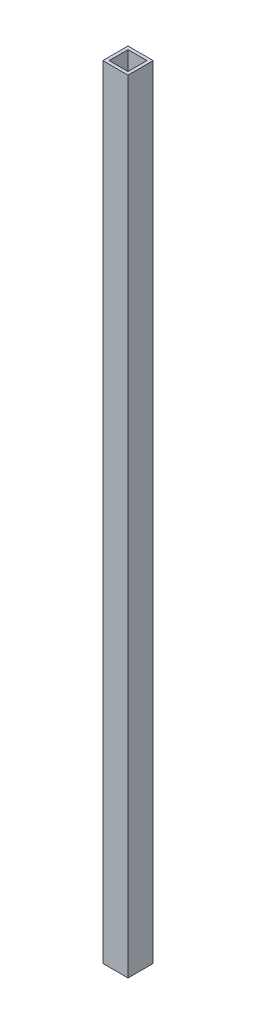
ISO-10303-21;
HEADER;
FILE_DESCRIPTION(('STEP AP214'),'2;1');
FILE_NAME('part.step','',(''),(''),'','','');
FILE_SCHEMA(('AUTOMOTIVE_DESIGN { 1 0 10303 214 1 1 1 1 }'));
ENDSEC;
DATA;
#1=APPLICATION_CONTEXT('core data for automotive mechanical design processes');
#2=APPLICATION_PROTOCOL_DEFINITION('international standard','automotive_design',2000,#1);
#3=PRODUCT_CONTEXT('',#1,'mechanical');
#4=PRODUCT('Part','Part','',(#3));
#5=PRODUCT_RELATED_PRODUCT_CATEGORY('part','',(#4));
#6=PRODUCT_DEFINITION_FORMATION('','',#4);
#7=PRODUCT_DEFINITION_CONTEXT('part definition',#1,'design');
#8=PRODUCT_DEFINITION('design','',#6,#7);
#9=PRODUCT_DEFINITION_SHAPE('','',#8);
#10=(LENGTH_UNIT() NAMED_UNIT(*) SI_UNIT(.MILLI.,.METRE.));
#11=(NAMED_UNIT(*) PLANE_ANGLE_UNIT() SI_UNIT($,.RADIAN.));
#12=(NAMED_UNIT(*) SI_UNIT($,.STERADIAN.) SOLID_ANGLE_UNIT());
#13=UNCERTAINTY_MEASURE_WITH_UNIT(LENGTH_MEASURE(1.E-05),#10,'distance_accuracy_value','');
#14=(GEOMETRIC_REPRESENTATION_CONTEXT(3) GLOBAL_UNCERTAINTY_ASSIGNED_CONTEXT((#13)) GLOBAL_UNIT_ASSIGNED_CONTEXT((#10,
#11,#12)) REPRESENTATION_CONTEXT('',''));
#15=CARTESIAN_POINT('',(0.,0.,0.));
#16=DIRECTION('',(0.,0.,1.));
#17=DIRECTION('',(1.,0.,0.));
#18=AXIS2_PLACEMENT_3D('',#15,#16,#17);
#19=CARTESIAN_POINT('',(0.,787.4,0.));
#20=DIRECTION('',(0.,-1.,0.));
#21=DIRECTION('',(0.,0.,-1.));
#22=AXIS2_PLACEMENT_3D('',#19,#20,#21);
#23=PLANE('',#22);
#24=DIRECTION('',(0.,0.,1.));
#25=VECTOR('',#24,1.);
#26=CARTESIAN_POINT('',(0.,787.4,0.));
#27=LINE('',#26,#25);
#28=CARTESIAN_POINT('',(0.,787.4,-25.4));
#29=VERTEX_POINT('',#28);
#30=CARTESIAN_POINT('',(0.,787.4,0.));
#31=VERTEX_POINT('',#30);
#32=EDGE_CURVE('E134',#29,#31,#27,.T.);
#33=ORIENTED_EDGE('',*,*,#32,.T.);
#34=DIRECTION('',(1.,0.,0.));
#35=VECTOR('',#34,1.);
#36=CARTESIAN_POINT('',(0.,787.4,0.));
#37=LINE('',#36,#35);
#38=CARTESIAN_POINT('',(25.4,787.4,0.));
#39=VERTEX_POINT('',#38);
#40=EDGE_CURVE('E137',#31,#39,#37,.T.);
#41=ORIENTED_EDGE('',*,*,#40,.T.);
#42=DIRECTION('',(0.,0.,-1.));
#43=VECTOR('',#42,1.);
#44=CARTESIAN_POINT('',(25.4,787.4,0.));
#45=LINE('',#44,#43);
#46=CARTESIAN_POINT('',(25.4,787.4,-25.4));
#47=VERTEX_POINT('',#46);
#48=EDGE_CURVE('E140',#39,#47,#45,.T.);
#49=ORIENTED_EDGE('',*,*,#48,.T.);
#50=DIRECTION('',(-1.,0.,0.));
#51=VECTOR('',#50,1.);
#52=CARTESIAN_POINT('',(0.,787.4,-25.4));
#53=LINE('',#52,#51);
#54=EDGE_CURVE('E142',#47,#29,#53,.T.);
#55=ORIENTED_EDGE('',*,*,#54,.T.);
#56=EDGE_LOOP('',(#33,#41,#49,#55));
#57=FACE_BOUND('',#56,.T.);
#58=DIRECTION('',(0.,0.,1.));
#59=VECTOR('',#58,1.);
#60=CARTESIAN_POINT('',(3.175,787.4,-3.175));
#61=LINE('',#60,#59);
#62=CARTESIAN_POINT('',(3.175,787.4,-22.225));
#63=VERTEX_POINT('',#62);
#64=CARTESIAN_POINT('',(3.175,787.4,-3.175));
#65=VERTEX_POINT('',#64);
#66=EDGE_CURVE('E98',#63,#65,#61,.T.);
#67=ORIENTED_EDGE('',*,*,#66,.F.);
#68=DIRECTION('',(-1.,0.,0.));
#69=VECTOR('',#68,1.);
#70=CARTESIAN_POINT('',(3.175,787.4,-22.225));
#71=LINE('',#70,#69);
#72=CARTESIAN_POINT('',(22.225,787.4,-22.225));
#73=VERTEX_POINT('',#72);
#74=EDGE_CURVE('E120',#73,#63,#71,.T.);
#75=ORIENTED_EDGE('',*,*,#74,.F.);
#76=DIRECTION('',(0.,0.,-1.));
#77=VECTOR('',#76,1.);
#78=CARTESIAN_POINT('',(22.225,787.4,-3.175));
#79=LINE('',#78,#77);
#80=CARTESIAN_POINT('',(22.225,787.4,-3.175));
#81=VERTEX_POINT('',#80);
#82=EDGE_CURVE('E118',#81,#73,#79,.T.);
#83=ORIENTED_EDGE('',*,*,#82,.F.);
#84=DIRECTION('',(1.,0.,0.));
#85=VECTOR('',#84,1.);
#86=CARTESIAN_POINT('',(3.175,787.4,-3.175));
#87=LINE('',#86,#85);
#88=EDGE_CURVE('E106',#65,#81,#87,.T.);
#89=ORIENTED_EDGE('',*,*,#88,.F.);
#90=EDGE_LOOP('',(#67,#75,#83,#89));
#91=FACE_BOUND('',#90,.T.);
#92=ADVANCED_FACE('F33',(#57,#91),#23,.F.);
#93=CARTESIAN_POINT('',(0.,0.,0.));
#94=DIRECTION('',(0.,-1.,0.));
#95=DIRECTION('',(0.,0.,-1.));
#96=AXIS2_PLACEMENT_3D('',#93,#94,#95);
#97=PLANE('',#96);
#98=DIRECTION('',(0.,0.,1.));
#99=VECTOR('',#98,1.);
#100=CARTESIAN_POINT('',(0.,0.,0.));
#101=LINE('',#100,#99);
#102=CARTESIAN_POINT('',(0.,0.,-25.4));
#103=VERTEX_POINT('',#102);
#104=CARTESIAN_POINT('',(0.,0.,0.));
#105=VERTEX_POINT('',#104);
#106=EDGE_CURVE('E114',#103,#105,#101,.T.);
#107=ORIENTED_EDGE('',*,*,#106,.F.);
#108=DIRECTION('',(-1.,0.,0.));
#109=VECTOR('',#108,1.);
#110=CARTESIAN_POINT('',(0.,0.,-25.4));
#111=LINE('',#110,#109);
#112=CARTESIAN_POINT('',(25.4,0.,-25.4));
#113=VERTEX_POINT('',#112);
#114=EDGE_CURVE('E138',#113,#103,#111,.T.);
#115=ORIENTED_EDGE('',*,*,#114,.F.);
#116=DIRECTION('',(0.,0.,-1.));
#117=VECTOR('',#116,1.);
#118=CARTESIAN_POINT('',(25.4,0.,0.));
#119=LINE('',#118,#117);
#120=CARTESIAN_POINT('',(25.4,0.,0.));
#121=VERTEX_POINT('',#120);
#122=EDGE_CURVE('E149',#121,#113,#119,.T.);
#123=ORIENTED_EDGE('',*,*,#122,.F.);
#124=DIRECTION('',(1.,0.,0.));
#125=VECTOR('',#124,1.);
#126=CARTESIAN_POINT('',(0.,0.,0.));
#127=LINE('',#126,#125);
#128=EDGE_CURVE('E147',#105,#121,#127,.T.);
#129=ORIENTED_EDGE('',*,*,#128,.F.);
#130=EDGE_LOOP('',(#107,#115,#123,#129));
#131=FACE_BOUND('',#130,.T.);
#132=DIRECTION('',(-1.,0.,0.));
#133=VECTOR('',#132,1.);
#134=CARTESIAN_POINT('',(3.175,0.,-22.225));
#135=LINE('',#134,#133);
#136=CARTESIAN_POINT('',(22.225,0.,-22.225));
#137=VERTEX_POINT('',#136);
#138=CARTESIAN_POINT('',(3.175,0.,-22.225));
#139=VERTEX_POINT('',#138);
#140=EDGE_CURVE('E107',#137,#139,#135,.T.);
#141=ORIENTED_EDGE('',*,*,#140,.T.);
#142=DIRECTION('',(0.,0.,1.));
#143=VECTOR('',#142,1.);
#144=CARTESIAN_POINT('',(3.175,0.,-3.175));
#145=LINE('',#144,#143);
#146=CARTESIAN_POINT('',(3.175,0.,-3.175));
#147=VERTEX_POINT('',#146);
#148=EDGE_CURVE('E56',#139,#147,#145,.T.);
#149=ORIENTED_EDGE('',*,*,#148,.T.);
#150=DIRECTION('',(1.,0.,0.));
#151=VECTOR('',#150,1.);
#152=CARTESIAN_POINT('',(3.175,0.,-3.175));
#153=LINE('',#152,#151);
#154=CARTESIAN_POINT('',(22.225,0.,-3.175));
#155=VERTEX_POINT('',#154);
#156=EDGE_CURVE('E113',#147,#155,#153,.T.);
#157=ORIENTED_EDGE('',*,*,#156,.T.);
#158=DIRECTION('',(0.,0.,-1.));
#159=VECTOR('',#158,1.);
#160=CARTESIAN_POINT('',(22.225,0.,-3.175));
#161=LINE('',#160,#159);
#162=EDGE_CURVE('E126',#155,#137,#161,.T.);
#163=ORIENTED_EDGE('',*,*,#162,.T.);
#164=EDGE_LOOP('',(#141,#149,#157,#163));
#165=FACE_BOUND('',#164,.T.);
#166=ADVANCED_FACE('F167',(#131,#165),#97,.T.);
#167=CARTESIAN_POINT('',(0.,787.4,0.));
#168=DIRECTION('',(1.,0.,0.));
#169=DIRECTION('',(0.,0.,-1.));
#170=AXIS2_PLACEMENT_3D('',#167,#168,#169);
#171=PLANE('',#170);
#172=ORIENTED_EDGE('',*,*,#106,.T.);
#173=DIRECTION('',(0.,-1.,0.));
#174=VECTOR('',#173,1.);
#175=CARTESIAN_POINT('',(0.,787.4,0.));
#176=LINE('',#175,#174);
#177=EDGE_CURVE('E11',#31,#105,#176,.T.);
#178=ORIENTED_EDGE('',*,*,#177,.F.);
#179=ORIENTED_EDGE('',*,*,#32,.F.);
#180=DIRECTION('',(0.,-1.,0.));
#181=VECTOR('',#180,1.);
#182=CARTESIAN_POINT('',(0.,787.4,-25.4));
#183=LINE('',#182,#181);
#184=EDGE_CURVE('E144',#29,#103,#183,.T.);
#185=ORIENTED_EDGE('',*,*,#184,.T.);
#186=EDGE_LOOP('',(#172,#178,#179,#185));
#187=FACE_BOUND('',#186,.T.);
#188=ADVANCED_FACE('F35',(#187),#171,.F.);
#189=CARTESIAN_POINT('',(0.,787.4,0.));
#190=DIRECTION('',(0.,0.,-1.));
#191=DIRECTION('',(-1.,0.,0.));
#192=AXIS2_PLACEMENT_3D('',#189,#190,#191);
#193=PLANE('',#192);
#194=ORIENTED_EDGE('',*,*,#128,.T.);
#195=DIRECTION('',(0.,-1.,0.));
#196=VECTOR('',#195,1.);
#197=CARTESIAN_POINT('',(25.4,787.4,0.));
#198=LINE('',#197,#196);
#199=EDGE_CURVE('E41',#39,#121,#198,.T.);
#200=ORIENTED_EDGE('',*,*,#199,.F.);
#201=ORIENTED_EDGE('',*,*,#40,.F.);
#202=ORIENTED_EDGE('',*,*,#177,.T.);
#203=EDGE_LOOP('',(#194,#200,#201,#202));
#204=FACE_BOUND('',#203,.T.);
#205=ADVANCED_FACE('F177',(#204),#193,.F.);
#206=CARTESIAN_POINT('',(25.4,787.4,0.));
#207=DIRECTION('',(-1.,0.,0.));
#208=DIRECTION('',(0.,0.,1.));
#209=AXIS2_PLACEMENT_3D('',#206,#207,#208);
#210=PLANE('',#209);
#211=ORIENTED_EDGE('',*,*,#122,.T.);
#212=DIRECTION('',(0.,-1.,0.));
#213=VECTOR('',#212,1.);
#214=CARTESIAN_POINT('',(25.4,787.4,-25.4));
#215=LINE('',#214,#213);
#216=EDGE_CURVE('E154',#47,#113,#215,.T.);
#217=ORIENTED_EDGE('',*,*,#216,.F.);
#218=ORIENTED_EDGE('',*,*,#48,.F.);
#219=ORIENTED_EDGE('',*,*,#199,.T.);
#220=EDGE_LOOP('',(#211,#217,#218,#219));
#221=FACE_BOUND('',#220,.T.);
#222=ADVANCED_FACE('F161',(#221),#210,.F.);
#223=CARTESIAN_POINT('',(0.,787.4,-25.4));
#224=DIRECTION('',(0.,0.,1.));
#225=DIRECTION('',(1.,0.,0.));
#226=AXIS2_PLACEMENT_3D('',#223,#224,#225);
#227=PLANE('',#226);
#228=ORIENTED_EDGE('',*,*,#114,.T.);
#229=ORIENTED_EDGE('',*,*,#184,.F.);
#230=ORIENTED_EDGE('',*,*,#54,.F.);
#231=ORIENTED_EDGE('',*,*,#216,.T.);
#232=EDGE_LOOP('',(#228,#229,#230,#231));
#233=FACE_BOUND('',#232,.T.);
#234=ADVANCED_FACE('F171',(#233),#227,.F.);
#235=CARTESIAN_POINT('',(3.175,787.4,-3.175));
#236=DIRECTION('',(1.,0.,0.));
#237=DIRECTION('',(0.,0.,-1.));
#238=AXIS2_PLACEMENT_3D('',#235,#236,#237);
#239=PLANE('',#238);
#240=ORIENTED_EDGE('',*,*,#148,.F.);
#241=DIRECTION('',(0.,-1.,0.));
#242=VECTOR('',#241,1.);
#243=CARTESIAN_POINT('',(3.175,787.4,-22.225));
#244=LINE('',#243,#242);
#245=EDGE_CURVE('E102',#63,#139,#244,.T.);
#246=ORIENTED_EDGE('',*,*,#245,.F.);
#247=ORIENTED_EDGE('',*,*,#66,.T.);
#248=DIRECTION('',(0.,-1.,0.));
#249=VECTOR('',#248,1.);
#250=CARTESIAN_POINT('',(3.175,787.4,-3.175));
#251=LINE('',#250,#249);
#252=EDGE_CURVE('E101',#65,#147,#251,.T.);
#253=ORIENTED_EDGE('',*,*,#252,.T.);
#254=EDGE_LOOP('',(#240,#246,#247,#253));
#255=FACE_BOUND('',#254,.T.);
#256=ADVANCED_FACE('F100',(#255),#239,.T.);
#257=CARTESIAN_POINT('',(3.175,787.4,-3.175));
#258=DIRECTION('',(0.,0.,-1.));
#259=DIRECTION('',(-1.,0.,0.));
#260=AXIS2_PLACEMENT_3D('',#257,#258,#259);
#261=PLANE('',#260);
#262=ORIENTED_EDGE('',*,*,#156,.F.);
#263=ORIENTED_EDGE('',*,*,#252,.F.);
#264=ORIENTED_EDGE('',*,*,#88,.T.);
#265=DIRECTION('',(0.,-1.,0.));
#266=VECTOR('',#265,1.);
#267=CARTESIAN_POINT('',(22.225,787.4,-3.175));
#268=LINE('',#267,#266);
#269=EDGE_CURVE('E115',#81,#155,#268,.T.);
#270=ORIENTED_EDGE('',*,*,#269,.T.);
#271=EDGE_LOOP('',(#262,#263,#264,#270));
#272=FACE_BOUND('',#271,.T.);
#273=ADVANCED_FACE('F110',(#272),#261,.T.);
#274=CARTESIAN_POINT('',(22.225,787.4,-3.175));
#275=DIRECTION('',(-1.,0.,0.));
#276=DIRECTION('',(0.,0.,1.));
#277=AXIS2_PLACEMENT_3D('',#274,#275,#276);
#278=PLANE('',#277);
#279=ORIENTED_EDGE('',*,*,#162,.F.);
#280=ORIENTED_EDGE('',*,*,#269,.F.);
#281=ORIENTED_EDGE('',*,*,#82,.T.);
#282=DIRECTION('',(0.,-1.,0.));
#283=VECTOR('',#282,1.);
#284=CARTESIAN_POINT('',(22.225,787.4,-22.225));
#285=LINE('',#284,#283);
#286=EDGE_CURVE('E48',#73,#137,#285,.T.);
#287=ORIENTED_EDGE('',*,*,#286,.T.);
#288=EDGE_LOOP('',(#279,#280,#281,#287));
#289=FACE_BOUND('',#288,.T.);
#290=ADVANCED_FACE('F200',(#289),#278,.T.);
#291=CARTESIAN_POINT('',(3.175,787.4,-22.225));
#292=DIRECTION('',(0.,0.,1.));
#293=DIRECTION('',(1.,0.,0.));
#294=AXIS2_PLACEMENT_3D('',#291,#292,#293);
#295=PLANE('',#294);
#296=ORIENTED_EDGE('',*,*,#140,.F.);
#297=ORIENTED_EDGE('',*,*,#286,.F.);
#298=ORIENTED_EDGE('',*,*,#74,.T.);
#299=ORIENTED_EDGE('',*,*,#245,.T.);
#300=EDGE_LOOP('',(#296,#297,#298,#299));
#301=FACE_BOUND('',#300,.T.);
#302=ADVANCED_FACE('F204',(#301),#295,.T.);
#303=CLOSED_SHELL('',(#92,#166,#188,#205,#222,#234,#256,#273,#290,#302));
#304=MANIFOLD_SOLID_BREP('B2',#303);
#305=ADVANCED_BREP_SHAPE_REPRESENTATION('',(#18,#304),#14);
#306=SHAPE_DEFINITION_REPRESENTATION(#9,#305);
ENDSEC;
END-ISO-10303-21;
